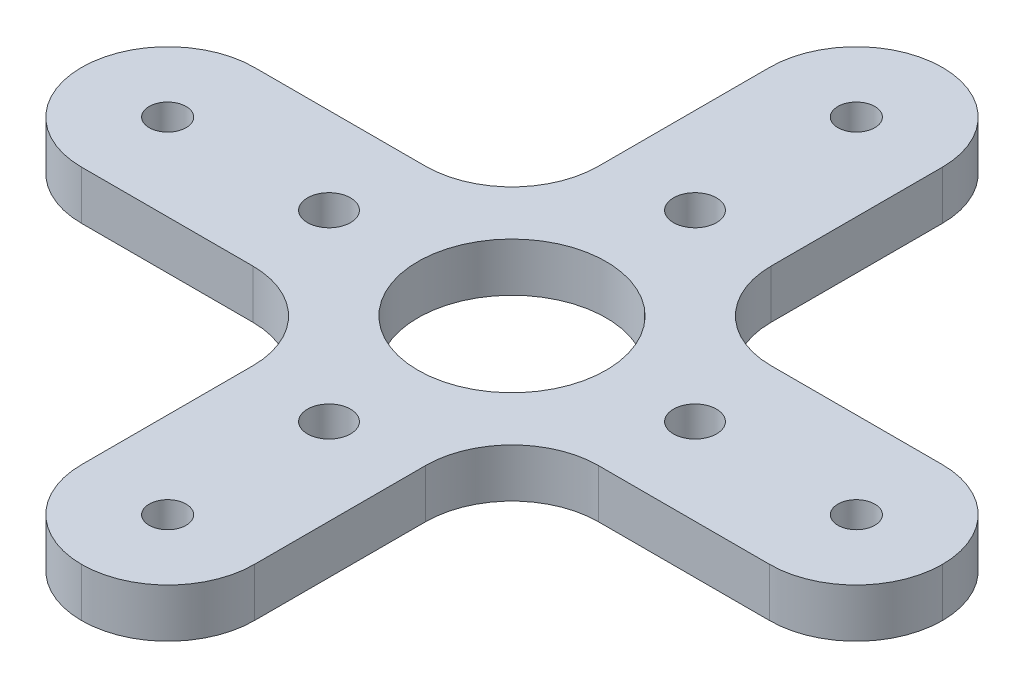
ISO-10303-21;
HEADER;
FILE_DESCRIPTION(('STEP AP214'),'2;1');
FILE_NAME('part.step','',(''),(''),'','','');
FILE_SCHEMA(('AUTOMOTIVE_DESIGN { 1 0 10303 214 1 1 1 1 }'));
ENDSEC;
DATA;
#1=APPLICATION_CONTEXT('core data for automotive mechanical design processes');
#2=APPLICATION_PROTOCOL_DEFINITION('international standard','automotive_design',2000,#1);
#3=PRODUCT_CONTEXT('',#1,'mechanical');
#4=PRODUCT('Part','Part','',(#3));
#5=PRODUCT_RELATED_PRODUCT_CATEGORY('part','',(#4));
#6=PRODUCT_DEFINITION_FORMATION('','',#4);
#7=PRODUCT_DEFINITION_CONTEXT('part definition',#1,'design');
#8=PRODUCT_DEFINITION('design','',#6,#7);
#9=PRODUCT_DEFINITION_SHAPE('','',#8);
#10=(LENGTH_UNIT() NAMED_UNIT(*) SI_UNIT(.MILLI.,.METRE.));
#11=(NAMED_UNIT(*) PLANE_ANGLE_UNIT() SI_UNIT($,.RADIAN.));
#12=(NAMED_UNIT(*) SI_UNIT($,.STERADIAN.) SOLID_ANGLE_UNIT());
#13=UNCERTAINTY_MEASURE_WITH_UNIT(LENGTH_MEASURE(1.E-05),#10,'distance_accuracy_value','');
#14=(GEOMETRIC_REPRESENTATION_CONTEXT(3) GLOBAL_UNCERTAINTY_ASSIGNED_CONTEXT((#13)) GLOBAL_UNIT_ASSIGNED_CONTEXT((#10,
#11,#12)) REPRESENTATION_CONTEXT('',''));
#15=CARTESIAN_POINT('',(0.,0.,0.));
#16=DIRECTION('',(0.,0.,1.));
#17=DIRECTION('',(1.,0.,0.));
#18=AXIS2_PLACEMENT_3D('',#15,#16,#17);
#19=CARTESIAN_POINT('',(7.025,3.96,-35.));
#20=DIRECTION('',(0.,1.,0.));
#21=DIRECTION('',(0.,0.,1.));
#22=AXIS2_PLACEMENT_3D('',#19,#20,#21);
#23=PLANE('',#22);
#24=CARTESIAN_POINT('',(0.,3.96,28.));
#25=DIRECTION('',(0.,1.,0.));
#26=DIRECTION('',(0.,0.,-1.));
#27=AXIS2_PLACEMENT_3D('',#24,#25,#26);
#28=CIRCLE('',#27,1.5);
#29=CARTESIAN_POINT('',(0.,3.96,26.5));
#30=VERTEX_POINT('',#29);
#31=EDGE_CURVE('E693',#30,#30,#28,.T.);
#32=ORIENTED_EDGE('',*,*,#31,.F.);
#33=EDGE_LOOP('',(#32));
#34=FACE_BOUND('',#33,.T.);
#35=CARTESIAN_POINT('',(0.,3.96,-14.88));
#36=DIRECTION('',(0.,1.,0.));
#37=DIRECTION('',(0.,0.,1.));
#38=AXIS2_PLACEMENT_3D('',#35,#36,#37);
#39=CIRCLE('',#38,1.75);
#40=CARTESIAN_POINT('',(0.,3.96,-13.13));
#41=VERTEX_POINT('',#40);
#42=EDGE_CURVE('E681',#41,#41,#39,.T.);
#43=ORIENTED_EDGE('',*,*,#42,.F.);
#44=EDGE_LOOP('',(#43));
#45=FACE_BOUND('',#44,.T.);
#46=CARTESIAN_POINT('',(28.,3.96,0.));
#47=DIRECTION('',(0.,1.,0.));
#48=DIRECTION('',(0.,0.,-1.));
#49=AXIS2_PLACEMENT_3D('',#46,#47,#48);
#50=CIRCLE('',#49,1.5);
#51=CARTESIAN_POINT('',(28.,3.96,-1.5));
#52=VERTEX_POINT('',#51);
#53=EDGE_CURVE('E669',#52,#52,#50,.T.);
#54=ORIENTED_EDGE('',*,*,#53,.F.);
#55=EDGE_LOOP('',(#54));
#56=FACE_BOUND('',#55,.T.);
#57=CARTESIAN_POINT('',(-14.88,3.96,0.));
#58=DIRECTION('',(0.,1.,0.));
#59=DIRECTION('',(0.,0.,1.));
#60=AXIS2_PLACEMENT_3D('',#57,#58,#59);
#61=CIRCLE('',#60,1.75);
#62=CARTESIAN_POINT('',(-14.88,3.96,1.75));
#63=VERTEX_POINT('',#62);
#64=EDGE_CURVE('E657',#63,#63,#61,.T.);
#65=ORIENTED_EDGE('',*,*,#64,.F.);
#66=EDGE_LOOP('',(#65));
#67=FACE_BOUND('',#66,.T.);
#68=CARTESIAN_POINT('',(27.975,3.96,0.));
#69=DIRECTION('',(0.,1.,0.));
#70=DIRECTION('',(0.,0.,1.));
#71=AXIS2_PLACEMENT_3D('',#68,#69,#70);
#72=CIRCLE('',#71,7.025);
#73=CARTESIAN_POINT('',(27.975,3.96,7.025));
#74=VERTEX_POINT('',#73);
#75=CARTESIAN_POINT('',(35.,3.96,0.));
#76=VERTEX_POINT('',#75);
#77=EDGE_CURVE('E48',#74,#76,#72,.T.);
#78=ORIENTED_EDGE('',*,*,#77,.T.);
#79=CARTESIAN_POINT('',(27.975,3.96,0.));
#80=DIRECTION('',(0.,1.,0.));
#81=DIRECTION('',(0.,0.,1.));
#82=AXIS2_PLACEMENT_3D('',#79,#80,#81);
#83=CIRCLE('',#82,7.025);
#84=CARTESIAN_POINT('',(27.975,3.96,-7.025));
#85=VERTEX_POINT('',#84);
#86=EDGE_CURVE('E181',#76,#85,#83,.T.);
#87=ORIENTED_EDGE('',*,*,#86,.T.);
#88=DIRECTION('',(-1.,0.,0.));
#89=VECTOR('',#88,1.);
#90=CARTESIAN_POINT('',(35.,3.96,-7.025));
#91=LINE('',#90,#89);
#92=CARTESIAN_POINT('',(14.05,3.96,-7.025));
#93=VERTEX_POINT('',#92);
#94=EDGE_CURVE('E332',#85,#93,#91,.T.);
#95=ORIENTED_EDGE('',*,*,#94,.T.);
#96=CARTESIAN_POINT('',(14.05,3.96,-14.05));
#97=DIRECTION('',(0.,1.,0.));
#98=DIRECTION('',(0.,0.,1.));
#99=AXIS2_PLACEMENT_3D('',#96,#97,#98);
#100=CIRCLE('',#99,7.025);
#101=CARTESIAN_POINT('',(7.02500000000001,3.96,-14.05));
#102=VERTEX_POINT('',#101);
#103=EDGE_CURVE('E277',#93,#102,#100,.F.);
#104=ORIENTED_EDGE('',*,*,#103,.T.);
#105=DIRECTION('',(0.,0.,-1.));
#106=VECTOR('',#105,1.);
#107=CARTESIAN_POINT('',(7.02500000000002,3.96,-7.025));
#108=LINE('',#107,#106);
#109=CARTESIAN_POINT('',(7.025,3.96,-27.975));
#110=VERTEX_POINT('',#109);
#111=EDGE_CURVE('E211',#102,#110,#108,.T.);
#112=ORIENTED_EDGE('',*,*,#111,.T.);
#113=CARTESIAN_POINT('',(0.,3.96,-27.975));
#114=DIRECTION('',(0.,1.,0.));
#115=DIRECTION('',(0.,0.,1.));
#116=AXIS2_PLACEMENT_3D('',#113,#114,#115);
#117=CIRCLE('',#116,7.025);
#118=CARTESIAN_POINT('',(0.,3.96,-35.));
#119=VERTEX_POINT('',#118);
#120=EDGE_CURVE('E263',#110,#119,#117,.T.);
#121=ORIENTED_EDGE('',*,*,#120,.T.);
#122=CARTESIAN_POINT('',(0.,3.96,-27.975));
#123=DIRECTION('',(0.,1.,0.));
#124=DIRECTION('',(0.,0.,1.));
#125=AXIS2_PLACEMENT_3D('',#122,#123,#124);
#126=CIRCLE('',#125,7.025);
#127=CARTESIAN_POINT('',(-7.025,3.96,-27.975));
#128=VERTEX_POINT('',#127);
#129=EDGE_CURVE('E261',#119,#128,#126,.T.);
#130=ORIENTED_EDGE('',*,*,#129,.T.);
#131=DIRECTION('',(0.,0.,1.));
#132=VECTOR('',#131,1.);
#133=CARTESIAN_POINT('',(-7.025,3.96,-7.025));
#134=LINE('',#133,#132);
#135=CARTESIAN_POINT('',(-7.025,3.96,-14.05));
#136=VERTEX_POINT('',#135);
#137=EDGE_CURVE('E210',#128,#136,#134,.T.);
#138=ORIENTED_EDGE('',*,*,#137,.T.);
#139=CARTESIAN_POINT('',(-14.05,3.96,-14.05));
#140=DIRECTION('',(0.,1.,0.));
#141=DIRECTION('',(0.,0.,1.));
#142=AXIS2_PLACEMENT_3D('',#139,#140,#141);
#143=CIRCLE('',#142,7.025);
#144=CARTESIAN_POINT('',(-14.05,3.96,-7.025));
#145=VERTEX_POINT('',#144);
#146=EDGE_CURVE('E281',#136,#145,#143,.F.);
#147=ORIENTED_EDGE('',*,*,#146,.T.);
#148=DIRECTION('',(-1.,0.,0.));
#149=VECTOR('',#148,1.);
#150=CARTESIAN_POINT('',(-35.,3.96,-7.025));
#151=LINE('',#150,#149);
#152=CARTESIAN_POINT('',(-27.975,3.96,-7.025));
#153=VERTEX_POINT('',#152);
#154=EDGE_CURVE('E315',#145,#153,#151,.T.);
#155=ORIENTED_EDGE('',*,*,#154,.T.);
#156=CARTESIAN_POINT('',(-27.975,3.96,0.));
#157=DIRECTION('',(0.,1.,0.));
#158=DIRECTION('',(0.,0.,1.));
#159=AXIS2_PLACEMENT_3D('',#156,#157,#158);
#160=CIRCLE('',#159,7.025);
#161=CARTESIAN_POINT('',(-35.,3.96,0.));
#162=VERTEX_POINT('',#161);
#163=EDGE_CURVE('E265',#153,#162,#160,.T.);
#164=ORIENTED_EDGE('',*,*,#163,.T.);
#165=CARTESIAN_POINT('',(-27.975,3.96,0.));
#166=DIRECTION('',(0.,1.,0.));
#167=DIRECTION('',(0.,0.,1.));
#168=AXIS2_PLACEMENT_3D('',#165,#166,#167);
#169=CIRCLE('',#168,7.025);
#170=CARTESIAN_POINT('',(-27.975,3.96,7.025));
#171=VERTEX_POINT('',#170);
#172=EDGE_CURVE('E267',#162,#171,#169,.T.);
#173=ORIENTED_EDGE('',*,*,#172,.T.);
#174=DIRECTION('',(1.,0.,0.));
#175=VECTOR('',#174,1.);
#176=CARTESIAN_POINT('',(-35.,3.96,7.025));
#177=LINE('',#176,#175);
#178=CARTESIAN_POINT('',(-14.05,3.96,7.025));
#179=VERTEX_POINT('',#178);
#180=EDGE_CURVE('E318',#171,#179,#177,.T.);
#181=ORIENTED_EDGE('',*,*,#180,.T.);
#182=CARTESIAN_POINT('',(-14.05,3.96,14.05));
#183=DIRECTION('',(0.,1.,0.));
#184=DIRECTION('',(0.,0.,1.));
#185=AXIS2_PLACEMENT_3D('',#182,#183,#184);
#186=CIRCLE('',#185,7.025);
#187=CARTESIAN_POINT('',(-7.02499999999999,3.96,14.05));
#188=VERTEX_POINT('',#187);
#189=EDGE_CURVE('E11',#179,#188,#186,.F.);
#190=ORIENTED_EDGE('',*,*,#189,.T.);
#191=DIRECTION('',(0.,0.,1.));
#192=VECTOR('',#191,1.);
#193=CARTESIAN_POINT('',(-7.025,3.96,7.025));
#194=LINE('',#193,#192);
#195=CARTESIAN_POINT('',(-7.02499999999998,3.96,27.975));
#196=VERTEX_POINT('',#195);
#197=EDGE_CURVE('E326',#188,#196,#194,.T.);
#198=ORIENTED_EDGE('',*,*,#197,.T.);
#199=CARTESIAN_POINT('',(0.,3.96,27.975));
#200=DIRECTION('',(0.,1.,0.));
#201=DIRECTION('',(0.,0.,1.));
#202=AXIS2_PLACEMENT_3D('',#199,#200,#201);
#203=CIRCLE('',#202,7.025);
#204=CARTESIAN_POINT('',(0.,3.96,35.));
#205=VERTEX_POINT('',#204);
#206=EDGE_CURVE('E55',#196,#205,#203,.T.);
#207=ORIENTED_EDGE('',*,*,#206,.T.);
#208=CARTESIAN_POINT('',(0.,3.96,27.975));
#209=DIRECTION('',(0.,1.,0.));
#210=DIRECTION('',(0.,0.,1.));
#211=AXIS2_PLACEMENT_3D('',#208,#209,#210);
#212=CIRCLE('',#211,7.025);
#213=CARTESIAN_POINT('',(7.025,3.96,27.975));
#214=VERTEX_POINT('',#213);
#215=EDGE_CURVE('E270',#205,#214,#212,.T.);
#216=ORIENTED_EDGE('',*,*,#215,.T.);
#217=DIRECTION('',(0.,0.,-1.));
#218=VECTOR('',#217,1.);
#219=CARTESIAN_POINT('',(7.02500000000002,3.96,7.025));
#220=LINE('',#219,#218);
#221=CARTESIAN_POINT('',(7.02500000000001,3.96,14.05));
#222=VERTEX_POINT('',#221);
#223=EDGE_CURVE('E328',#214,#222,#220,.T.);
#224=ORIENTED_EDGE('',*,*,#223,.T.);
#225=CARTESIAN_POINT('',(14.05,3.96,14.05));
#226=DIRECTION('',(0.,1.,0.));
#227=DIRECTION('',(0.,0.,1.));
#228=AXIS2_PLACEMENT_3D('',#225,#226,#227);
#229=CIRCLE('',#228,7.025);
#230=CARTESIAN_POINT('',(14.05,3.96,7.025));
#231=VERTEX_POINT('',#230);
#232=EDGE_CURVE('E180',#222,#231,#229,.F.);
#233=ORIENTED_EDGE('',*,*,#232,.T.);
#234=DIRECTION('',(1.,0.,0.));
#235=VECTOR('',#234,1.);
#236=CARTESIAN_POINT('',(35.,3.96,7.025));
#237=LINE('',#236,#235);
#238=EDGE_CURVE('E189',#231,#74,#237,.T.);
#239=ORIENTED_EDGE('',*,*,#238,.T.);
#240=EDGE_LOOP('',(#78,#87,#95,#104,#112,#121,#130,#138,#147,#155,#164,#173,#181,#190,#198,#207,
#216,#224,#233,#239));
#241=FACE_BOUND('',#240,.T.);
#242=CARTESIAN_POINT('',(0.,3.96,0.));
#243=DIRECTION('',(0.,1.,0.));
#244=DIRECTION('',(0.,0.,1.));
#245=AXIS2_PLACEMENT_3D('',#242,#243,#244);
#246=CIRCLE('',#245,7.655);
#247=CARTESIAN_POINT('',(0.,3.96,7.655));
#248=VERTEX_POINT('',#247);
#249=EDGE_CURVE('E339',#248,#248,#246,.T.);
#250=ORIENTED_EDGE('',*,*,#249,.F.);
#251=EDGE_LOOP('',(#250));
#252=FACE_BOUND('',#251,.T.);
#253=CARTESIAN_POINT('',(-28.,3.96,0.));
#254=DIRECTION('',(0.,1.,0.));
#255=DIRECTION('',(0.,0.,1.));
#256=AXIS2_PLACEMENT_3D('',#253,#254,#255);
#257=CIRCLE('',#256,1.5);
#258=CARTESIAN_POINT('',(-28.,3.96,1.5));
#259=VERTEX_POINT('',#258);
#260=EDGE_CURVE('E663',#259,#259,#257,.T.);
#261=ORIENTED_EDGE('',*,*,#260,.F.);
#262=EDGE_LOOP('',(#261));
#263=FACE_BOUND('',#262,.T.);
#264=CARTESIAN_POINT('',(14.88,3.96,0.));
#265=DIRECTION('',(0.,1.,0.));
#266=DIRECTION('',(0.,0.,-1.));
#267=AXIS2_PLACEMENT_3D('',#264,#265,#266);
#268=CIRCLE('',#267,1.75);
#269=CARTESIAN_POINT('',(14.88,3.96,-1.75));
#270=VERTEX_POINT('',#269);
#271=EDGE_CURVE('E675',#270,#270,#268,.T.);
#272=ORIENTED_EDGE('',*,*,#271,.F.);
#273=EDGE_LOOP('',(#272));
#274=FACE_BOUND('',#273,.T.);
#275=CARTESIAN_POINT('',(0.,3.96,-28.));
#276=DIRECTION('',(0.,1.,0.));
#277=DIRECTION('',(0.,0.,1.));
#278=AXIS2_PLACEMENT_3D('',#275,#276,#277);
#279=CIRCLE('',#278,1.5);
#280=CARTESIAN_POINT('',(0.,3.96,-26.5));
#281=VERTEX_POINT('',#280);
#282=EDGE_CURVE('E687',#281,#281,#279,.T.);
#283=ORIENTED_EDGE('',*,*,#282,.F.);
#284=EDGE_LOOP('',(#283));
#285=FACE_BOUND('',#284,.T.);
#286=CARTESIAN_POINT('',(0.,3.96,14.88));
#287=DIRECTION('',(0.,1.,0.));
#288=DIRECTION('',(0.,0.,-1.));
#289=AXIS2_PLACEMENT_3D('',#286,#287,#288);
#290=CIRCLE('',#289,1.75);
#291=CARTESIAN_POINT('',(0.,3.96,13.13));
#292=VERTEX_POINT('',#291);
#293=EDGE_CURVE('E699',#292,#292,#290,.T.);
#294=ORIENTED_EDGE('',*,*,#293,.F.);
#295=EDGE_LOOP('',(#294));
#296=FACE_BOUND('',#295,.T.);
#297=ADVANCED_FACE('F31',(#34,#45,#56,#67,#241,#252,#263,#274,#285,#296),#23,.T.);
#298=CARTESIAN_POINT('',(7.025,0.,-35.));
#299=DIRECTION('',(0.,1.,0.));
#300=DIRECTION('',(0.,0.,1.));
#301=AXIS2_PLACEMENT_3D('',#298,#299,#300);
#302=PLANE('',#301);
#303=CARTESIAN_POINT('',(0.,0.,28.));
#304=DIRECTION('',(0.,1.,0.));
#305=DIRECTION('',(0.,0.,-1.));
#306=AXIS2_PLACEMENT_3D('',#303,#304,#305);
#307=CIRCLE('',#306,1.5);
#308=CARTESIAN_POINT('',(0.,0.,26.5));
#309=VERTEX_POINT('',#308);
#310=EDGE_CURVE('E696',#309,#309,#307,.T.);
#311=ORIENTED_EDGE('',*,*,#310,.T.);
#312=EDGE_LOOP('',(#311));
#313=FACE_BOUND('',#312,.T.);
#314=CARTESIAN_POINT('',(0.,0.,-14.88));
#315=DIRECTION('',(0.,1.,0.));
#316=DIRECTION('',(0.,0.,1.));
#317=AXIS2_PLACEMENT_3D('',#314,#315,#316);
#318=CIRCLE('',#317,1.75);
#319=CARTESIAN_POINT('',(0.,0.,-13.13));
#320=VERTEX_POINT('',#319);
#321=EDGE_CURVE('E684',#320,#320,#318,.T.);
#322=ORIENTED_EDGE('',*,*,#321,.T.);
#323=EDGE_LOOP('',(#322));
#324=FACE_BOUND('',#323,.T.);
#325=CARTESIAN_POINT('',(28.,0.,0.));
#326=DIRECTION('',(0.,1.,0.));
#327=DIRECTION('',(0.,0.,-1.));
#328=AXIS2_PLACEMENT_3D('',#325,#326,#327);
#329=CIRCLE('',#328,1.5);
#330=CARTESIAN_POINT('',(28.,0.,-1.5));
#331=VERTEX_POINT('',#330);
#332=EDGE_CURVE('E672',#331,#331,#329,.T.);
#333=ORIENTED_EDGE('',*,*,#332,.T.);
#334=EDGE_LOOP('',(#333));
#335=FACE_BOUND('',#334,.T.);
#336=CARTESIAN_POINT('',(-14.88,0.,0.));
#337=DIRECTION('',(0.,1.,0.));
#338=DIRECTION('',(0.,0.,1.));
#339=AXIS2_PLACEMENT_3D('',#336,#337,#338);
#340=CIRCLE('',#339,1.75);
#341=CARTESIAN_POINT('',(-14.88,0.,1.75));
#342=VERTEX_POINT('',#341);
#343=EDGE_CURVE('E659',#342,#342,#340,.T.);
#344=ORIENTED_EDGE('',*,*,#343,.T.);
#345=EDGE_LOOP('',(#344));
#346=FACE_BOUND('',#345,.T.);
#347=DIRECTION('',(-1.,0.,0.));
#348=VECTOR('',#347,1.);
#349=CARTESIAN_POINT('',(35.,0.,-7.025));
#350=LINE('',#349,#348);
#351=CARTESIAN_POINT('',(27.975,0.,-7.025));
#352=VERTEX_POINT('',#351);
#353=CARTESIAN_POINT('',(14.05,0.,-7.025));
#354=VERTEX_POINT('',#353);
#355=EDGE_CURVE('E198',#352,#354,#350,.T.);
#356=ORIENTED_EDGE('',*,*,#355,.F.);
#357=CARTESIAN_POINT('',(27.975,0.,0.));
#358=DIRECTION('',(0.,1.,0.));
#359=DIRECTION('',(0.,0.,1.));
#360=AXIS2_PLACEMENT_3D('',#357,#358,#359);
#361=CIRCLE('',#360,7.025);
#362=CARTESIAN_POINT('',(35.,0.,0.));
#363=VERTEX_POINT('',#362);
#364=EDGE_CURVE('E259',#352,#363,#361,.F.);
#365=ORIENTED_EDGE('',*,*,#364,.T.);
#366=CARTESIAN_POINT('',(27.975,0.,0.));
#367=DIRECTION('',(0.,1.,0.));
#368=DIRECTION('',(0.,0.,1.));
#369=AXIS2_PLACEMENT_3D('',#366,#367,#368);
#370=CIRCLE('',#369,7.025);
#371=CARTESIAN_POINT('',(27.975,0.,7.025));
#372=VERTEX_POINT('',#371);
#373=EDGE_CURVE('E197',#363,#372,#370,.F.);
#374=ORIENTED_EDGE('',*,*,#373,.T.);
#375=DIRECTION('',(1.,0.,0.));
#376=VECTOR('',#375,1.);
#377=CARTESIAN_POINT('',(35.,0.,7.025));
#378=LINE('',#377,#376);
#379=CARTESIAN_POINT('',(14.05,0.,7.025));
#380=VERTEX_POINT('',#379);
#381=EDGE_CURVE('E187',#380,#372,#378,.T.);
#382=ORIENTED_EDGE('',*,*,#381,.F.);
#383=CARTESIAN_POINT('',(14.05,0.,14.05));
#384=DIRECTION('',(0.,1.,0.));
#385=DIRECTION('',(0.,0.,1.));
#386=AXIS2_PLACEMENT_3D('',#383,#384,#385);
#387=CIRCLE('',#386,7.025);
#388=CARTESIAN_POINT('',(7.02500000000001,0.,14.05));
#389=VERTEX_POINT('',#388);
#390=EDGE_CURVE('E170',#380,#389,#387,.T.);
#391=ORIENTED_EDGE('',*,*,#390,.T.);
#392=DIRECTION('',(0.,0.,-1.));
#393=VECTOR('',#392,1.);
#394=CARTESIAN_POINT('',(7.02500000000002,0.,7.025));
#395=LINE('',#394,#393);
#396=CARTESIAN_POINT('',(7.025,0.,27.975));
#397=VERTEX_POINT('',#396);
#398=EDGE_CURVE('E199',#397,#389,#395,.T.);
#399=ORIENTED_EDGE('',*,*,#398,.F.);
#400=CARTESIAN_POINT('',(0.,0.,27.975));
#401=DIRECTION('',(0.,1.,0.));
#402=DIRECTION('',(0.,0.,1.));
#403=AXIS2_PLACEMENT_3D('',#400,#401,#402);
#404=CIRCLE('',#403,7.025);
#405=CARTESIAN_POINT('',(0.,0.,35.));
#406=VERTEX_POINT('',#405);
#407=EDGE_CURVE('E256',#397,#406,#404,.F.);
#408=ORIENTED_EDGE('',*,*,#407,.T.);
#409=CARTESIAN_POINT('',(0.,0.,27.975));
#410=DIRECTION('',(0.,1.,0.));
#411=DIRECTION('',(0.,0.,1.));
#412=AXIS2_PLACEMENT_3D('',#409,#410,#411);
#413=CIRCLE('',#412,7.025);
#414=CARTESIAN_POINT('',(-7.02499999999998,0.,27.975));
#415=VERTEX_POINT('',#414);
#416=EDGE_CURVE('E254',#406,#415,#413,.F.);
#417=ORIENTED_EDGE('',*,*,#416,.T.);
#418=DIRECTION('',(0.,0.,1.));
#419=VECTOR('',#418,1.);
#420=CARTESIAN_POINT('',(-7.025,0.,7.025));
#421=LINE('',#420,#419);
#422=CARTESIAN_POINT('',(-7.02499999999999,0.,14.05));
#423=VERTEX_POINT('',#422);
#424=EDGE_CURVE('E204',#423,#415,#421,.T.);
#425=ORIENTED_EDGE('',*,*,#424,.F.);
#426=CARTESIAN_POINT('',(-14.05,0.,14.05));
#427=DIRECTION('',(0.,1.,0.));
#428=DIRECTION('',(0.,0.,1.));
#429=AXIS2_PLACEMENT_3D('',#426,#427,#428);
#430=CIRCLE('',#429,7.025);
#431=CARTESIAN_POINT('',(-14.05,0.,7.025));
#432=VERTEX_POINT('',#431);
#433=EDGE_CURVE('E40',#423,#432,#430,.T.);
#434=ORIENTED_EDGE('',*,*,#433,.T.);
#435=DIRECTION('',(1.,0.,0.));
#436=VECTOR('',#435,1.);
#437=CARTESIAN_POINT('',(-35.,0.,7.025));
#438=LINE('',#437,#436);
#439=CARTESIAN_POINT('',(-27.975,0.,7.025));
#440=VERTEX_POINT('',#439);
#441=EDGE_CURVE('E342',#440,#432,#438,.T.);
#442=ORIENTED_EDGE('',*,*,#441,.F.);
#443=CARTESIAN_POINT('',(-27.975,0.,0.));
#444=DIRECTION('',(0.,1.,0.));
#445=DIRECTION('',(0.,0.,1.));
#446=AXIS2_PLACEMENT_3D('',#443,#444,#445);
#447=CIRCLE('',#446,7.025);
#448=CARTESIAN_POINT('',(-35.,0.,0.));
#449=VERTEX_POINT('',#448);
#450=EDGE_CURVE('E252',#440,#449,#447,.F.);
#451=ORIENTED_EDGE('',*,*,#450,.T.);
#452=CARTESIAN_POINT('',(-27.975,0.,0.));
#453=DIRECTION('',(0.,1.,0.));
#454=DIRECTION('',(0.,0.,1.));
#455=AXIS2_PLACEMENT_3D('',#452,#453,#454);
#456=CIRCLE('',#455,7.025);
#457=CARTESIAN_POINT('',(-27.975,0.,-7.025));
#458=VERTEX_POINT('',#457);
#459=EDGE_CURVE('E250',#449,#458,#456,.F.);
#460=ORIENTED_EDGE('',*,*,#459,.T.);
#461=DIRECTION('',(-1.,0.,0.));
#462=VECTOR('',#461,1.);
#463=CARTESIAN_POINT('',(-35.,0.,-7.025));
#464=LINE('',#463,#462);
#465=CARTESIAN_POINT('',(-14.05,0.,-7.025));
#466=VERTEX_POINT('',#465);
#467=EDGE_CURVE('E338',#466,#458,#464,.T.);
#468=ORIENTED_EDGE('',*,*,#467,.F.);
#469=CARTESIAN_POINT('',(-14.05,0.,-14.05));
#470=DIRECTION('',(0.,1.,0.));
#471=DIRECTION('',(0.,0.,1.));
#472=AXIS2_PLACEMENT_3D('',#469,#470,#471);
#473=CIRCLE('',#472,7.025);
#474=CARTESIAN_POINT('',(-7.025,0.,-14.05));
#475=VERTEX_POINT('',#474);
#476=EDGE_CURVE('E279',#466,#475,#473,.T.);
#477=ORIENTED_EDGE('',*,*,#476,.T.);
#478=DIRECTION('',(0.,0.,1.));
#479=VECTOR('',#478,1.);
#480=CARTESIAN_POINT('',(-7.025,0.,-7.025));
#481=LINE('',#480,#479);
#482=CARTESIAN_POINT('',(-7.025,0.,-27.975));
#483=VERTEX_POINT('',#482);
#484=EDGE_CURVE('E336',#483,#475,#481,.T.);
#485=ORIENTED_EDGE('',*,*,#484,.F.);
#486=CARTESIAN_POINT('',(0.,0.,-27.975));
#487=DIRECTION('',(0.,1.,0.));
#488=DIRECTION('',(0.,0.,1.));
#489=AXIS2_PLACEMENT_3D('',#486,#487,#488);
#490=CIRCLE('',#489,7.025);
#491=CARTESIAN_POINT('',(0.,0.,-35.));
#492=VERTEX_POINT('',#491);
#493=EDGE_CURVE('E246',#483,#492,#490,.F.);
#494=ORIENTED_EDGE('',*,*,#493,.T.);
#495=CARTESIAN_POINT('',(0.,0.,-27.975));
#496=DIRECTION('',(0.,1.,0.));
#497=DIRECTION('',(0.,0.,1.));
#498=AXIS2_PLACEMENT_3D('',#495,#496,#497);
#499=CIRCLE('',#498,7.025);
#500=CARTESIAN_POINT('',(7.025,0.,-27.975));
#501=VERTEX_POINT('',#500);
#502=EDGE_CURVE('E248',#492,#501,#499,.F.);
#503=ORIENTED_EDGE('',*,*,#502,.T.);
#504=DIRECTION('',(0.,0.,-1.));
#505=VECTOR('',#504,1.);
#506=CARTESIAN_POINT('',(7.02500000000002,0.,-7.025));
#507=LINE('',#506,#505);
#508=CARTESIAN_POINT('',(7.02500000000001,0.,-14.05));
#509=VERTEX_POINT('',#508);
#510=EDGE_CURVE('E202',#509,#501,#507,.T.);
#511=ORIENTED_EDGE('',*,*,#510,.F.);
#512=CARTESIAN_POINT('',(14.05,0.,-14.05));
#513=DIRECTION('',(0.,1.,0.));
#514=DIRECTION('',(0.,0.,1.));
#515=AXIS2_PLACEMENT_3D('',#512,#513,#514);
#516=CIRCLE('',#515,7.025);
#517=EDGE_CURVE('E275',#509,#354,#516,.T.);
#518=ORIENTED_EDGE('',*,*,#517,.T.);
#519=EDGE_LOOP('',(#356,#365,#374,#382,#391,#399,#408,#417,#425,#434,#442,#451,#460,#468,#477,
#485,#494,#503,#511,#518));
#520=FACE_BOUND('',#519,.T.);
#521=CARTESIAN_POINT('',(0.,0.,0.));
#522=DIRECTION('',(0.,1.,0.));
#523=DIRECTION('',(0.,0.,1.));
#524=AXIS2_PLACEMENT_3D('',#521,#522,#523);
#525=CIRCLE('',#524,7.655);
#526=CARTESIAN_POINT('',(0.,0.,7.655));
#527=VERTEX_POINT('',#526);
#528=EDGE_CURVE('E321',#527,#527,#525,.T.);
#529=ORIENTED_EDGE('',*,*,#528,.T.);
#530=EDGE_LOOP('',(#529));
#531=FACE_BOUND('',#530,.T.);
#532=CARTESIAN_POINT('',(-28.,0.,0.));
#533=DIRECTION('',(0.,1.,0.));
#534=DIRECTION('',(0.,0.,1.));
#535=AXIS2_PLACEMENT_3D('',#532,#533,#534);
#536=CIRCLE('',#535,1.5);
#537=CARTESIAN_POINT('',(-28.,0.,1.5));
#538=VERTEX_POINT('',#537);
#539=EDGE_CURVE('E666',#538,#538,#536,.T.);
#540=ORIENTED_EDGE('',*,*,#539,.T.);
#541=EDGE_LOOP('',(#540));
#542=FACE_BOUND('',#541,.T.);
#543=CARTESIAN_POINT('',(14.88,0.,0.));
#544=DIRECTION('',(0.,1.,0.));
#545=DIRECTION('',(0.,0.,-1.));
#546=AXIS2_PLACEMENT_3D('',#543,#544,#545);
#547=CIRCLE('',#546,1.75);
#548=CARTESIAN_POINT('',(14.88,0.,-1.75));
#549=VERTEX_POINT('',#548);
#550=EDGE_CURVE('E678',#549,#549,#547,.T.);
#551=ORIENTED_EDGE('',*,*,#550,.T.);
#552=EDGE_LOOP('',(#551));
#553=FACE_BOUND('',#552,.T.);
#554=CARTESIAN_POINT('',(0.,0.,-28.));
#555=DIRECTION('',(0.,1.,0.));
#556=DIRECTION('',(0.,0.,1.));
#557=AXIS2_PLACEMENT_3D('',#554,#555,#556);
#558=CIRCLE('',#557,1.5);
#559=CARTESIAN_POINT('',(0.,0.,-26.5));
#560=VERTEX_POINT('',#559);
#561=EDGE_CURVE('E690',#560,#560,#558,.T.);
#562=ORIENTED_EDGE('',*,*,#561,.T.);
#563=EDGE_LOOP('',(#562));
#564=FACE_BOUND('',#563,.T.);
#565=CARTESIAN_POINT('',(0.,0.,14.88));
#566=DIRECTION('',(0.,1.,0.));
#567=DIRECTION('',(0.,0.,-1.));
#568=AXIS2_PLACEMENT_3D('',#565,#566,#567);
#569=CIRCLE('',#568,1.75);
#570=CARTESIAN_POINT('',(0.,0.,13.13));
#571=VERTEX_POINT('',#570);
#572=EDGE_CURVE('E287',#571,#571,#569,.T.);
#573=ORIENTED_EDGE('',*,*,#572,.T.);
#574=EDGE_LOOP('',(#573));
#575=FACE_BOUND('',#574,.T.);
#576=ADVANCED_FACE('F194',(#313,#324,#335,#346,#520,#531,#542,#553,#564,#575),#302,.F.);
#577=CARTESIAN_POINT('',(-7.025,3.96,-7.025));
#578=DIRECTION('',(1.,0.,0.));
#579=DIRECTION('',(0.,0.,-1.));
#580=AXIS2_PLACEMENT_3D('',#577,#578,#579);
#581=PLANE('',#580);
#582=ORIENTED_EDGE('',*,*,#484,.T.);
#583=DIRECTION('',(0.,-1.,0.));
#584=VECTOR('',#583,1.);
#585=CARTESIAN_POINT('',(-7.025,3.96,-14.05));
#586=LINE('',#585,#584);
#587=EDGE_CURVE('E234',#475,#136,#586,.F.);
#588=ORIENTED_EDGE('',*,*,#587,.T.);
#589=ORIENTED_EDGE('',*,*,#137,.F.);
#590=DIRECTION('',(0.,-1.,0.));
#591=VECTOR('',#590,1.);
#592=CARTESIAN_POINT('',(-7.025,3.96,-27.975));
#593=LINE('',#592,#591);
#594=EDGE_CURVE('E232',#128,#483,#593,.T.);
#595=ORIENTED_EDGE('',*,*,#594,.T.);
#596=EDGE_LOOP('',(#582,#588,#589,#595));
#597=FACE_BOUND('',#596,.T.);
#598=ADVANCED_FACE('F312',(#597),#581,.F.);
#599=CARTESIAN_POINT('',(-35.,3.96,-7.025));
#600=DIRECTION('',(0.,0.,1.));
#601=DIRECTION('',(1.,0.,0.));
#602=AXIS2_PLACEMENT_3D('',#599,#600,#601);
#603=PLANE('',#602);
#604=ORIENTED_EDGE('',*,*,#154,.F.);
#605=DIRECTION('',(0.,-1.,0.));
#606=VECTOR('',#605,1.);
#607=CARTESIAN_POINT('',(-14.05,0.,-7.025));
#608=LINE('',#607,#606);
#609=EDGE_CURVE('E229',#145,#466,#608,.T.);
#610=ORIENTED_EDGE('',*,*,#609,.T.);
#611=ORIENTED_EDGE('',*,*,#467,.T.);
#612=DIRECTION('',(0.,-1.,0.));
#613=VECTOR('',#612,1.);
#614=CARTESIAN_POINT('',(-27.975,3.96,-7.025));
#615=LINE('',#614,#613);
#616=EDGE_CURVE('E227',#458,#153,#615,.F.);
#617=ORIENTED_EDGE('',*,*,#616,.T.);
#618=EDGE_LOOP('',(#604,#610,#611,#617));
#619=FACE_BOUND('',#618,.T.);
#620=ADVANCED_FACE('F409',(#619),#603,.F.);
#621=CARTESIAN_POINT('',(-35.,3.96,7.025));
#622=DIRECTION('',(0.,0.,-1.));
#623=DIRECTION('',(-1.,0.,0.));
#624=AXIS2_PLACEMENT_3D('',#621,#622,#623);
#625=PLANE('',#624);
#626=ORIENTED_EDGE('',*,*,#441,.T.);
#627=DIRECTION('',(0.,-1.,0.));
#628=VECTOR('',#627,1.);
#629=CARTESIAN_POINT('',(-14.05,3.96,7.025));
#630=LINE('',#629,#628);
#631=EDGE_CURVE('E244',#432,#179,#630,.F.);
#632=ORIENTED_EDGE('',*,*,#631,.T.);
#633=ORIENTED_EDGE('',*,*,#180,.F.);
#634=DIRECTION('',(0.,-1.,0.));
#635=VECTOR('',#634,1.);
#636=CARTESIAN_POINT('',(-27.975,3.96,7.025));
#637=LINE('',#636,#635);
#638=EDGE_CURVE('E241',#171,#440,#637,.T.);
#639=ORIENTED_EDGE('',*,*,#638,.T.);
#640=EDGE_LOOP('',(#626,#632,#633,#639));
#641=FACE_BOUND('',#640,.T.);
#642=ADVANCED_FACE('F369',(#641),#625,.F.);
#643=CARTESIAN_POINT('',(-7.025,3.96,7.025));
#644=DIRECTION('',(1.,0.,0.));
#645=DIRECTION('',(0.,0.,-1.));
#646=AXIS2_PLACEMENT_3D('',#643,#644,#645);
#647=PLANE('',#646);
#648=ORIENTED_EDGE('',*,*,#197,.F.);
#649=DIRECTION('',(0.,-1.,0.));
#650=VECTOR('',#649,1.);
#651=CARTESIAN_POINT('',(-7.02499999999999,0.,14.05));
#652=LINE('',#651,#650);
#653=EDGE_CURVE('E238',#188,#423,#652,.T.);
#654=ORIENTED_EDGE('',*,*,#653,.T.);
#655=ORIENTED_EDGE('',*,*,#424,.T.);
#656=DIRECTION('',(0.,-1.,0.));
#657=VECTOR('',#656,1.);
#658=CARTESIAN_POINT('',(-7.02499999999998,3.96,27.975));
#659=LINE('',#658,#657);
#660=EDGE_CURVE('E236',#415,#196,#659,.F.);
#661=ORIENTED_EDGE('',*,*,#660,.T.);
#662=EDGE_LOOP('',(#648,#654,#655,#661));
#663=FACE_BOUND('',#662,.T.);
#664=ADVANCED_FACE('F349',(#663),#647,.F.);
#665=CARTESIAN_POINT('',(7.02500000000002,3.96,7.025));
#666=DIRECTION('',(-1.,0.,0.));
#667=DIRECTION('',(0.,0.,1.));
#668=AXIS2_PLACEMENT_3D('',#665,#666,#667);
#669=PLANE('',#668);
#670=ORIENTED_EDGE('',*,*,#398,.T.);
#671=DIRECTION('',(0.,-1.,0.));
#672=VECTOR('',#671,1.);
#673=CARTESIAN_POINT('',(7.02500000000001,3.96,14.05));
#674=LINE('',#673,#672);
#675=EDGE_CURVE('E175',#389,#222,#674,.F.);
#676=ORIENTED_EDGE('',*,*,#675,.T.);
#677=ORIENTED_EDGE('',*,*,#223,.F.);
#678=DIRECTION('',(0.,-1.,0.));
#679=VECTOR('',#678,1.);
#680=CARTESIAN_POINT('',(7.025,3.96,27.975));
#681=LINE('',#680,#679);
#682=EDGE_CURVE('E190',#214,#397,#681,.T.);
#683=ORIENTED_EDGE('',*,*,#682,.T.);
#684=EDGE_LOOP('',(#670,#676,#677,#683));
#685=FACE_BOUND('',#684,.T.);
#686=ADVANCED_FACE('F360',(#685),#669,.F.);
#687=CARTESIAN_POINT('',(35.,3.96,7.025));
#688=DIRECTION('',(0.,0.,-1.));
#689=DIRECTION('',(-1.,0.,0.));
#690=AXIS2_PLACEMENT_3D('',#687,#688,#689);
#691=PLANE('',#690);
#692=ORIENTED_EDGE('',*,*,#238,.F.);
#693=DIRECTION('',(0.,-1.,0.));
#694=VECTOR('',#693,1.);
#695=CARTESIAN_POINT('',(14.05,0.,7.025));
#696=LINE('',#695,#694);
#697=EDGE_CURVE('E174',#231,#380,#696,.T.);
#698=ORIENTED_EDGE('',*,*,#697,.T.);
#699=ORIENTED_EDGE('',*,*,#381,.T.);
#700=DIRECTION('',(0.,-1.,0.));
#701=VECTOR('',#700,1.);
#702=CARTESIAN_POINT('',(27.975,3.96,7.025));
#703=LINE('',#702,#701);
#704=EDGE_CURVE('E191',#372,#74,#703,.F.);
#705=ORIENTED_EDGE('',*,*,#704,.T.);
#706=EDGE_LOOP('',(#692,#698,#699,#705));
#707=FACE_BOUND('',#706,.T.);
#708=ADVANCED_FACE('F186',(#707),#691,.F.);
#709=CARTESIAN_POINT('',(35.,3.96,-7.025));
#710=DIRECTION('',(0.,0.,1.));
#711=DIRECTION('',(1.,0.,0.));
#712=AXIS2_PLACEMENT_3D('',#709,#710,#711);
#713=PLANE('',#712);
#714=ORIENTED_EDGE('',*,*,#355,.T.);
#715=DIRECTION('',(0.,-1.,0.));
#716=VECTOR('',#715,1.);
#717=CARTESIAN_POINT('',(14.05,3.96,-7.025));
#718=LINE('',#717,#716);
#719=EDGE_CURVE('E225',#354,#93,#718,.F.);
#720=ORIENTED_EDGE('',*,*,#719,.T.);
#721=ORIENTED_EDGE('',*,*,#94,.F.);
#722=DIRECTION('',(0.,-1.,0.));
#723=VECTOR('',#722,1.);
#724=CARTESIAN_POINT('',(27.975,3.96,-7.025));
#725=LINE('',#724,#723);
#726=EDGE_CURVE('E222',#85,#352,#725,.T.);
#727=ORIENTED_EDGE('',*,*,#726,.T.);
#728=EDGE_LOOP('',(#714,#720,#721,#727));
#729=FACE_BOUND('',#728,.T.);
#730=ADVANCED_FACE('F367',(#729),#713,.F.);
#731=CARTESIAN_POINT('',(7.02500000000002,3.96,-7.025));
#732=DIRECTION('',(-1.,0.,0.));
#733=DIRECTION('',(0.,0.,1.));
#734=AXIS2_PLACEMENT_3D('',#731,#732,#733);
#735=PLANE('',#734);
#736=ORIENTED_EDGE('',*,*,#111,.F.);
#737=DIRECTION('',(0.,-1.,0.));
#738=VECTOR('',#737,1.);
#739=CARTESIAN_POINT('',(7.02500000000001,0.,-14.05));
#740=LINE('',#739,#738);
#741=EDGE_CURVE('E219',#102,#509,#740,.T.);
#742=ORIENTED_EDGE('',*,*,#741,.T.);
#743=ORIENTED_EDGE('',*,*,#510,.T.);
#744=DIRECTION('',(0.,-1.,0.));
#745=VECTOR('',#744,1.);
#746=CARTESIAN_POINT('',(7.025,3.96,-27.975));
#747=LINE('',#746,#745);
#748=EDGE_CURVE('E216',#501,#110,#747,.F.);
#749=ORIENTED_EDGE('',*,*,#748,.T.);
#750=EDGE_LOOP('',(#736,#742,#743,#749));
#751=FACE_BOUND('',#750,.T.);
#752=ADVANCED_FACE('F385',(#751),#735,.F.);
#753=CARTESIAN_POINT('',(0.,3.96,0.));
#754=DIRECTION('',(0.,-1.,0.));
#755=DIRECTION('',(0.,0.,-1.));
#756=AXIS2_PLACEMENT_3D('',#753,#754,#755);
#757=CYLINDRICAL_SURFACE('',#756,7.655);
#758=ORIENTED_EDGE('',*,*,#249,.T.);
#759=EDGE_LOOP('',(#758));
#760=FACE_BOUND('',#759,.T.);
#761=ORIENTED_EDGE('',*,*,#528,.F.);
#762=EDGE_LOOP('',(#761));
#763=FACE_BOUND('',#762,.T.);
#764=ADVANCED_FACE('F382',(#760,#763),#757,.F.);
#765=CARTESIAN_POINT('',(-14.88,3.96,0.));
#766=DIRECTION('',(0.,-1.,0.));
#767=DIRECTION('',(0.,0.,-1.));
#768=AXIS2_PLACEMENT_3D('',#765,#766,#767);
#769=CYLINDRICAL_SURFACE('',#768,1.75);
#770=ORIENTED_EDGE('',*,*,#64,.T.);
#771=EDGE_LOOP('',(#770));
#772=FACE_BOUND('',#771,.T.);
#773=ORIENTED_EDGE('',*,*,#343,.F.);
#774=EDGE_LOOP('',(#773));
#775=FACE_BOUND('',#774,.T.);
#776=ADVANCED_FACE('F633',(#772,#775),#769,.F.);
#777=CARTESIAN_POINT('',(-28.,3.96,0.));
#778=DIRECTION('',(0.,-1.,0.));
#779=DIRECTION('',(0.,0.,-1.));
#780=AXIS2_PLACEMENT_3D('',#777,#778,#779);
#781=CYLINDRICAL_SURFACE('',#780,1.5);
#782=ORIENTED_EDGE('',*,*,#260,.T.);
#783=EDGE_LOOP('',(#782));
#784=FACE_BOUND('',#783,.T.);
#785=ORIENTED_EDGE('',*,*,#539,.F.);
#786=EDGE_LOOP('',(#785));
#787=FACE_BOUND('',#786,.T.);
#788=ADVANCED_FACE('F623',(#784,#787),#781,.F.);
#789=CARTESIAN_POINT('',(28.,3.96,0.));
#790=DIRECTION('',(0.,-1.,0.));
#791=DIRECTION('',(0.,0.,-1.));
#792=AXIS2_PLACEMENT_3D('',#789,#790,#791);
#793=CYLINDRICAL_SURFACE('',#792,1.5);
#794=ORIENTED_EDGE('',*,*,#53,.T.);
#795=EDGE_LOOP('',(#794));
#796=FACE_BOUND('',#795,.T.);
#797=ORIENTED_EDGE('',*,*,#332,.F.);
#798=EDGE_LOOP('',(#797));
#799=FACE_BOUND('',#798,.T.);
#800=ADVANCED_FACE('F613',(#796,#799),#793,.F.);
#801=CARTESIAN_POINT('',(14.88,3.96,0.));
#802=DIRECTION('',(0.,-1.,0.));
#803=DIRECTION('',(0.,0.,-1.));
#804=AXIS2_PLACEMENT_3D('',#801,#802,#803);
#805=CYLINDRICAL_SURFACE('',#804,1.75);
#806=ORIENTED_EDGE('',*,*,#271,.T.);
#807=EDGE_LOOP('',(#806));
#808=FACE_BOUND('',#807,.T.);
#809=ORIENTED_EDGE('',*,*,#550,.F.);
#810=EDGE_LOOP('',(#809));
#811=FACE_BOUND('',#810,.T.);
#812=ADVANCED_FACE('F603',(#808,#811),#805,.F.);
#813=CARTESIAN_POINT('',(0.,3.96,-14.88));
#814=DIRECTION('',(0.,-1.,0.));
#815=DIRECTION('',(0.,0.,-1.));
#816=AXIS2_PLACEMENT_3D('',#813,#814,#815);
#817=CYLINDRICAL_SURFACE('',#816,1.75);
#818=ORIENTED_EDGE('',*,*,#42,.T.);
#819=EDGE_LOOP('',(#818));
#820=FACE_BOUND('',#819,.T.);
#821=ORIENTED_EDGE('',*,*,#321,.F.);
#822=EDGE_LOOP('',(#821));
#823=FACE_BOUND('',#822,.T.);
#824=ADVANCED_FACE('F593',(#820,#823),#817,.F.);
#825=CARTESIAN_POINT('',(0.,3.96,-28.));
#826=DIRECTION('',(0.,-1.,0.));
#827=DIRECTION('',(0.,0.,-1.));
#828=AXIS2_PLACEMENT_3D('',#825,#826,#827);
#829=CYLINDRICAL_SURFACE('',#828,1.5);
#830=ORIENTED_EDGE('',*,*,#282,.T.);
#831=EDGE_LOOP('',(#830));
#832=FACE_BOUND('',#831,.T.);
#833=ORIENTED_EDGE('',*,*,#561,.F.);
#834=EDGE_LOOP('',(#833));
#835=FACE_BOUND('',#834,.T.);
#836=ADVANCED_FACE('F583',(#832,#835),#829,.F.);
#837=CARTESIAN_POINT('',(0.,3.96,28.));
#838=DIRECTION('',(0.,-1.,0.));
#839=DIRECTION('',(0.,0.,-1.));
#840=AXIS2_PLACEMENT_3D('',#837,#838,#839);
#841=CYLINDRICAL_SURFACE('',#840,1.5);
#842=ORIENTED_EDGE('',*,*,#31,.T.);
#843=EDGE_LOOP('',(#842));
#844=FACE_BOUND('',#843,.T.);
#845=ORIENTED_EDGE('',*,*,#310,.F.);
#846=EDGE_LOOP('',(#845));
#847=FACE_BOUND('',#846,.T.);
#848=ADVANCED_FACE('F573',(#844,#847),#841,.F.);
#849=CARTESIAN_POINT('',(0.,3.96,14.88));
#850=DIRECTION('',(0.,-1.,0.));
#851=DIRECTION('',(0.,0.,-1.));
#852=AXIS2_PLACEMENT_3D('',#849,#850,#851);
#853=CYLINDRICAL_SURFACE('',#852,1.75);
#854=ORIENTED_EDGE('',*,*,#293,.T.);
#855=EDGE_LOOP('',(#854));
#856=FACE_BOUND('',#855,.T.);
#857=ORIENTED_EDGE('',*,*,#572,.F.);
#858=EDGE_LOOP('',(#857));
#859=FACE_BOUND('',#858,.T.);
#860=ADVANCED_FACE('F502',(#856,#859),#853,.F.);
#861=CARTESIAN_POINT('',(14.05,3.96,14.05));
#862=DIRECTION('',(0.,1.,0.));
#863=DIRECTION('',(0.,0.,1.));
#864=AXIS2_PLACEMENT_3D('',#861,#862,#863);
#865=CYLINDRICAL_SURFACE('',#864,7.025);
#866=ORIENTED_EDGE('',*,*,#232,.F.);
#867=ORIENTED_EDGE('',*,*,#675,.F.);
#868=ORIENTED_EDGE('',*,*,#390,.F.);
#869=ORIENTED_EDGE('',*,*,#697,.F.);
#870=EDGE_LOOP('',(#866,#867,#868,#869));
#871=FACE_BOUND('',#870,.T.);
#872=ADVANCED_FACE('F173',(#871),#865,.F.);
#873=CARTESIAN_POINT('',(14.05,3.96,-14.05));
#874=DIRECTION('',(0.,1.,0.));
#875=DIRECTION('',(0.,0.,1.));
#876=AXIS2_PLACEMENT_3D('',#873,#874,#875);
#877=CYLINDRICAL_SURFACE('',#876,7.025);
#878=ORIENTED_EDGE('',*,*,#103,.F.);
#879=ORIENTED_EDGE('',*,*,#719,.F.);
#880=ORIENTED_EDGE('',*,*,#517,.F.);
#881=ORIENTED_EDGE('',*,*,#741,.F.);
#882=EDGE_LOOP('',(#878,#879,#880,#881));
#883=FACE_BOUND('',#882,.T.);
#884=ADVANCED_FACE('F398',(#883),#877,.F.);
#885=CARTESIAN_POINT('',(-14.05,3.96,-14.05));
#886=DIRECTION('',(0.,1.,0.));
#887=DIRECTION('',(0.,0.,1.));
#888=AXIS2_PLACEMENT_3D('',#885,#886,#887);
#889=CYLINDRICAL_SURFACE('',#888,7.025);
#890=ORIENTED_EDGE('',*,*,#146,.F.);
#891=ORIENTED_EDGE('',*,*,#587,.F.);
#892=ORIENTED_EDGE('',*,*,#476,.F.);
#893=ORIENTED_EDGE('',*,*,#609,.F.);
#894=EDGE_LOOP('',(#890,#891,#892,#893));
#895=FACE_BOUND('',#894,.T.);
#896=ADVANCED_FACE('F404',(#895),#889,.F.);
#897=CARTESIAN_POINT('',(-14.05,3.96,14.05));
#898=DIRECTION('',(0.,1.,0.));
#899=DIRECTION('',(0.,0.,1.));
#900=AXIS2_PLACEMENT_3D('',#897,#898,#899);
#901=CYLINDRICAL_SURFACE('',#900,7.025);
#902=ORIENTED_EDGE('',*,*,#189,.F.);
#903=ORIENTED_EDGE('',*,*,#631,.F.);
#904=ORIENTED_EDGE('',*,*,#433,.F.);
#905=ORIENTED_EDGE('',*,*,#653,.F.);
#906=EDGE_LOOP('',(#902,#903,#904,#905));
#907=FACE_BOUND('',#906,.T.);
#908=ADVANCED_FACE('F422',(#907),#901,.F.);
#909=CARTESIAN_POINT('',(27.975,3.96,0.));
#910=DIRECTION('',(0.,-1.,0.));
#911=DIRECTION('',(0.,0.,-1.));
#912=AXIS2_PLACEMENT_3D('',#909,#910,#911);
#913=CYLINDRICAL_SURFACE('',#912,7.025);
#914=DIRECTION('',(0.,-1.,0.));
#915=VECTOR('',#914,1.);
#916=CARTESIAN_POINT('',(35.,3.96,0.));
#917=LINE('',#916,#915);
#918=EDGE_CURVE('E284',#76,#363,#917,.T.);
#919=ORIENTED_EDGE('',*,*,#918,.F.);
#920=ORIENTED_EDGE('',*,*,#77,.F.);
#921=ORIENTED_EDGE('',*,*,#704,.F.);
#922=ORIENTED_EDGE('',*,*,#373,.F.);
#923=EDGE_LOOP('',(#919,#920,#921,#922));
#924=FACE_BOUND('',#923,.T.);
#925=ADVANCED_FACE('F424',(#924),#913,.T.);
#926=CARTESIAN_POINT('',(27.975,3.96,0.));
#927=DIRECTION('',(0.,-1.,0.));
#928=DIRECTION('',(0.,0.,-1.));
#929=AXIS2_PLACEMENT_3D('',#926,#927,#928);
#930=CYLINDRICAL_SURFACE('',#929,7.025);
#931=ORIENTED_EDGE('',*,*,#86,.F.);
#932=ORIENTED_EDGE('',*,*,#918,.T.);
#933=ORIENTED_EDGE('',*,*,#364,.F.);
#934=ORIENTED_EDGE('',*,*,#726,.F.);
#935=EDGE_LOOP('',(#931,#932,#933,#934));
#936=FACE_BOUND('',#935,.T.);
#937=ADVANCED_FACE('F430',(#936),#930,.T.);
#938=CARTESIAN_POINT('',(0.,3.96,27.975));
#939=DIRECTION('',(0.,-1.,0.));
#940=DIRECTION('',(0.,0.,-1.));
#941=AXIS2_PLACEMENT_3D('',#938,#939,#940);
#942=CYLINDRICAL_SURFACE('',#941,7.025);
#943=DIRECTION('',(0.,-1.,0.));
#944=VECTOR('',#943,1.);
#945=CARTESIAN_POINT('',(0.,3.96,35.));
#946=LINE('',#945,#944);
#947=EDGE_CURVE('E288',#205,#406,#946,.T.);
#948=ORIENTED_EDGE('',*,*,#947,.F.);
#949=ORIENTED_EDGE('',*,*,#206,.F.);
#950=ORIENTED_EDGE('',*,*,#660,.F.);
#951=ORIENTED_EDGE('',*,*,#416,.F.);
#952=EDGE_LOOP('',(#948,#949,#950,#951));
#953=FACE_BOUND('',#952,.T.);
#954=ADVANCED_FACE('F353',(#953),#942,.T.);
#955=CARTESIAN_POINT('',(0.,3.96,27.975));
#956=DIRECTION('',(0.,-1.,0.));
#957=DIRECTION('',(0.,0.,-1.));
#958=AXIS2_PLACEMENT_3D('',#955,#956,#957);
#959=CYLINDRICAL_SURFACE('',#958,7.025);
#960=ORIENTED_EDGE('',*,*,#215,.F.);
#961=ORIENTED_EDGE('',*,*,#947,.T.);
#962=ORIENTED_EDGE('',*,*,#407,.F.);
#963=ORIENTED_EDGE('',*,*,#682,.F.);
#964=EDGE_LOOP('',(#960,#961,#962,#963));
#965=FACE_BOUND('',#964,.T.);
#966=ADVANCED_FACE('F357',(#965),#959,.T.);
#967=CARTESIAN_POINT('',(-27.975,3.96,0.));
#968=DIRECTION('',(0.,-1.,0.));
#969=DIRECTION('',(0.,0.,-1.));
#970=AXIS2_PLACEMENT_3D('',#967,#968,#969);
#971=CYLINDRICAL_SURFACE('',#970,7.025);
#972=DIRECTION('',(0.,-1.,0.));
#973=VECTOR('',#972,1.);
#974=CARTESIAN_POINT('',(-35.,3.96,0.));
#975=LINE('',#974,#973);
#976=EDGE_CURVE('E290',#162,#449,#975,.T.);
#977=ORIENTED_EDGE('',*,*,#976,.F.);
#978=ORIENTED_EDGE('',*,*,#163,.F.);
#979=ORIENTED_EDGE('',*,*,#616,.F.);
#980=ORIENTED_EDGE('',*,*,#459,.F.);
#981=EDGE_LOOP('',(#977,#978,#979,#980));
#982=FACE_BOUND('',#981,.T.);
#983=ADVANCED_FACE('F413',(#982),#971,.T.);
#984=CARTESIAN_POINT('',(-27.975,3.96,0.));
#985=DIRECTION('',(0.,-1.,0.));
#986=DIRECTION('',(0.,0.,-1.));
#987=AXIS2_PLACEMENT_3D('',#984,#985,#986);
#988=CYLINDRICAL_SURFACE('',#987,7.025);
#989=ORIENTED_EDGE('',*,*,#172,.F.);
#990=ORIENTED_EDGE('',*,*,#976,.T.);
#991=ORIENTED_EDGE('',*,*,#450,.F.);
#992=ORIENTED_EDGE('',*,*,#638,.F.);
#993=EDGE_LOOP('',(#989,#990,#991,#992));
#994=FACE_BOUND('',#993,.T.);
#995=ADVANCED_FACE('F420',(#994),#988,.T.);
#996=CARTESIAN_POINT('',(0.,3.96,-27.975));
#997=DIRECTION('',(0.,-1.,0.));
#998=DIRECTION('',(0.,0.,-1.));
#999=AXIS2_PLACEMENT_3D('',#996,#997,#998);
#1000=CYLINDRICAL_SURFACE('',#999,7.025);
#1001=ORIENTED_EDGE('',*,*,#594,.F.);
#1002=ORIENTED_EDGE('',*,*,#129,.F.);
#1003=DIRECTION('',(0.,-1.,0.));
#1004=VECTOR('',#1003,1.);
#1005=CARTESIAN_POINT('',(0.,3.96,-35.));
#1006=LINE('',#1005,#1004);
#1007=EDGE_CURVE('E35',#492,#119,#1006,.F.);
#1008=ORIENTED_EDGE('',*,*,#1007,.F.);
#1009=ORIENTED_EDGE('',*,*,#493,.F.);
#1010=EDGE_LOOP('',(#1001,#1002,#1008,#1009));
#1011=FACE_BOUND('',#1010,.T.);
#1012=ADVANCED_FACE('F33',(#1011),#1000,.T.);
#1013=CARTESIAN_POINT('',(0.,3.96,-27.975));
#1014=DIRECTION('',(0.,-1.,0.));
#1015=DIRECTION('',(0.,0.,-1.));
#1016=AXIS2_PLACEMENT_3D('',#1013,#1014,#1015);
#1017=CYLINDRICAL_SURFACE('',#1016,7.025);
#1018=ORIENTED_EDGE('',*,*,#120,.F.);
#1019=ORIENTED_EDGE('',*,*,#748,.F.);
#1020=ORIENTED_EDGE('',*,*,#502,.F.);
#1021=ORIENTED_EDGE('',*,*,#1007,.T.);
#1022=EDGE_LOOP('',(#1018,#1019,#1020,#1021));
#1023=FACE_BOUND('',#1022,.T.);
#1024=ADVANCED_FACE('F299',(#1023),#1017,.T.);
#1025=CLOSED_SHELL('',(#297,#576,#598,#620,#642,#664,#686,#708,#730,#752,#764,#776,#788,#800,
#812,#824,#836,#848,#860,#872,#884,#896,#908,#925,#937,#954,#966,#983,#995,#1012,#1024));
#1026=MANIFOLD_SOLID_BREP('B2',#1025);
#1027=ADVANCED_BREP_SHAPE_REPRESENTATION('',(#18,#1026),#14);
#1028=SHAPE_DEFINITION_REPRESENTATION(#9,#1027);
ENDSEC;
END-ISO-10303-21;
